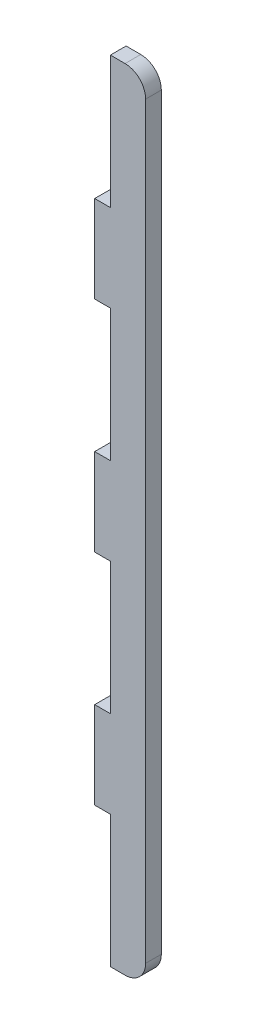
ISO-10303-21;
HEADER;
FILE_DESCRIPTION(('STEP AP214'),'2;1');
FILE_NAME('part.step','',(''),(''),'','','');
FILE_SCHEMA(('AUTOMOTIVE_DESIGN { 1 0 10303 214 1 1 1 1 }'));
ENDSEC;
DATA;
#1=APPLICATION_CONTEXT('core data for automotive mechanical design processes');
#2=APPLICATION_PROTOCOL_DEFINITION('international standard','automotive_design',2000,#1);
#3=PRODUCT_CONTEXT('',#1,'mechanical');
#4=PRODUCT('Part','Part','',(#3));
#5=PRODUCT_RELATED_PRODUCT_CATEGORY('part','',(#4));
#6=PRODUCT_DEFINITION_FORMATION('','',#4);
#7=PRODUCT_DEFINITION_CONTEXT('part definition',#1,'design');
#8=PRODUCT_DEFINITION('design','',#6,#7);
#9=PRODUCT_DEFINITION_SHAPE('','',#8);
#10=(LENGTH_UNIT() NAMED_UNIT(*) SI_UNIT(.MILLI.,.METRE.));
#11=(NAMED_UNIT(*) PLANE_ANGLE_UNIT() SI_UNIT($,.RADIAN.));
#12=(NAMED_UNIT(*) SI_UNIT($,.STERADIAN.) SOLID_ANGLE_UNIT());
#13=UNCERTAINTY_MEASURE_WITH_UNIT(LENGTH_MEASURE(1.E-05),#10,'distance_accuracy_value','');
#14=(GEOMETRIC_REPRESENTATION_CONTEXT(3) GLOBAL_UNCERTAINTY_ASSIGNED_CONTEXT((#13)) GLOBAL_UNIT_ASSIGNED_CONTEXT((#10,
#11,#12)) REPRESENTATION_CONTEXT('',''));
#15=CARTESIAN_POINT('',(0.,0.,0.));
#16=DIRECTION('',(0.,0.,1.));
#17=DIRECTION('',(1.,0.,0.));
#18=AXIS2_PLACEMENT_3D('',#15,#16,#17);
#19=CARTESIAN_POINT('',(0.,0.,5.35));
#20=DIRECTION('',(1.,0.,0.));
#21=DIRECTION('',(0.,1.,0.));
#22=AXIS2_PLACEMENT_3D('',#19,#20,#21);
#23=PLANE('',#22);
#24=DIRECTION('',(0.,-1.,0.));
#25=VECTOR('',#24,1.);
#26=CARTESIAN_POINT('',(0.,0.,0.));
#27=LINE('',#26,#25);
#28=CARTESIAN_POINT('',(0.,45.0005,0.));
#29=VERTEX_POINT('',#28);
#30=CARTESIAN_POINT('',(0.,0.,0.));
#31=VERTEX_POINT('',#30);
#32=EDGE_CURVE('E189',#29,#31,#27,.T.);
#33=ORIENTED_EDGE('',*,*,#32,.T.);
#34=DIRECTION('',(0.,0.,-1.));
#35=VECTOR('',#34,1.);
#36=CARTESIAN_POINT('',(0.,0.,5.35));
#37=LINE('',#36,#35);
#38=CARTESIAN_POINT('',(0.,0.,5.35));
#39=VERTEX_POINT('',#38);
#40=EDGE_CURVE('E11',#39,#31,#37,.T.);
#41=ORIENTED_EDGE('',*,*,#40,.F.);
#42=DIRECTION('',(0.,-1.,0.));
#43=VECTOR('',#42,1.);
#44=CARTESIAN_POINT('',(0.,0.,5.35));
#45=LINE('',#44,#43);
#46=CARTESIAN_POINT('',(0.,45.0005,5.35));
#47=VERTEX_POINT('',#46);
#48=EDGE_CURVE('E223',#47,#39,#45,.T.);
#49=ORIENTED_EDGE('',*,*,#48,.F.);
#50=DIRECTION('',(0.,0.,-1.));
#51=VECTOR('',#50,1.);
#52=CARTESIAN_POINT('',(0.,45.0005,5.35));
#53=LINE('',#52,#51);
#54=EDGE_CURVE('E185',#47,#29,#53,.T.);
#55=ORIENTED_EDGE('',*,*,#54,.T.);
#56=EDGE_LOOP('',(#33,#41,#49,#55));
#57=FACE_BOUND('',#56,.T.);
#58=ADVANCED_FACE('F33',(#57),#23,.F.);
#59=CARTESIAN_POINT('',(0.,0.,5.35));
#60=DIRECTION('',(0.,1.,0.));
#61=DIRECTION('',(0.,0.,1.));
#62=AXIS2_PLACEMENT_3D('',#59,#60,#61);
#63=PLANE('',#62);
#64=DIRECTION('',(1.,0.,0.));
#65=VECTOR('',#64,1.);
#66=CARTESIAN_POINT('',(0.,0.,0.));
#67=LINE('',#66,#65);
#68=CARTESIAN_POINT('',(5.,0.,0.));
#69=VERTEX_POINT('',#68);
#70=EDGE_CURVE('E192',#31,#69,#67,.T.);
#71=ORIENTED_EDGE('',*,*,#70,.T.);
#72=DIRECTION('',(0.,0.,-1.));
#73=VECTOR('',#72,1.);
#74=CARTESIAN_POINT('',(5.,0.,5.35));
#75=LINE('',#74,#73);
#76=CARTESIAN_POINT('',(5.,0.,5.35));
#77=VERTEX_POINT('',#76);
#78=EDGE_CURVE('E41',#77,#69,#75,.T.);
#79=ORIENTED_EDGE('',*,*,#78,.F.);
#80=DIRECTION('',(1.,0.,0.));
#81=VECTOR('',#80,1.);
#82=CARTESIAN_POINT('',(0.,0.,5.35));
#83=LINE('',#82,#81);
#84=EDGE_CURVE('E122',#39,#77,#83,.T.);
#85=ORIENTED_EDGE('',*,*,#84,.F.);
#86=ORIENTED_EDGE('',*,*,#40,.T.);
#87=EDGE_LOOP('',(#71,#79,#85,#86));
#88=FACE_BOUND('',#87,.T.);
#89=ADVANCED_FACE('F331',(#88),#63,.F.);
#90=CARTESIAN_POINT('',(5.,7.00000000000001,5.35));
#91=DIRECTION('',(0.,0.,-1.));
#92=DIRECTION('',(-1.,0.,0.));
#93=AXIS2_PLACEMENT_3D('',#90,#91,#92);
#94=CYLINDRICAL_SURFACE('',#93,7.);
#95=CARTESIAN_POINT('',(5.,7.00000000000001,0.));
#96=DIRECTION('',(0.,0.,1.));
#97=DIRECTION('',(1.,0.,0.));
#98=AXIS2_PLACEMENT_3D('',#95,#96,#97);
#99=CIRCLE('',#98,7.);
#100=CARTESIAN_POINT('',(12.,7.,0.));
#101=VERTEX_POINT('',#100);
#102=EDGE_CURVE('E194',#69,#101,#99,.T.);
#103=ORIENTED_EDGE('',*,*,#102,.T.);
#104=DIRECTION('',(0.,0.,-1.));
#105=VECTOR('',#104,1.);
#106=CARTESIAN_POINT('',(12.,7.,5.35));
#107=LINE('',#106,#105);
#108=CARTESIAN_POINT('',(12.,7.,5.35));
#109=VERTEX_POINT('',#108);
#110=EDGE_CURVE('E260',#109,#101,#107,.T.);
#111=ORIENTED_EDGE('',*,*,#110,.F.);
#112=CARTESIAN_POINT('',(5.,7.00000000000001,5.35));
#113=DIRECTION('',(0.,0.,1.));
#114=DIRECTION('',(1.,0.,0.));
#115=AXIS2_PLACEMENT_3D('',#112,#113,#114);
#116=CIRCLE('',#115,7.);
#117=EDGE_CURVE('E268',#77,#109,#116,.T.);
#118=ORIENTED_EDGE('',*,*,#117,.F.);
#119=ORIENTED_EDGE('',*,*,#78,.T.);
#120=EDGE_LOOP('',(#103,#111,#118,#119));
#121=FACE_BOUND('',#120,.T.);
#122=ADVANCED_FACE('F266',(#121),#94,.T.);
#123=CARTESIAN_POINT('',(12.,7.,5.35));
#124=DIRECTION('',(-1.,0.,0.));
#125=DIRECTION('',(0.,-1.,0.));
#126=AXIS2_PLACEMENT_3D('',#123,#124,#125);
#127=PLANE('',#126);
#128=DIRECTION('',(0.,1.,0.));
#129=VECTOR('',#128,1.);
#130=CARTESIAN_POINT('',(12.,7.,0.));
#131=LINE('',#130,#129);
#132=CARTESIAN_POINT('',(12.,262.,0.));
#133=VERTEX_POINT('',#132);
#134=EDGE_CURVE('E196',#101,#133,#131,.T.);
#135=ORIENTED_EDGE('',*,*,#134,.T.);
#136=DIRECTION('',(0.,0.,-1.));
#137=VECTOR('',#136,1.);
#138=CARTESIAN_POINT('',(12.,262.,5.35));
#139=LINE('',#138,#137);
#140=CARTESIAN_POINT('',(12.,262.,5.35));
#141=VERTEX_POINT('',#140);
#142=EDGE_CURVE('E257',#141,#133,#139,.T.);
#143=ORIENTED_EDGE('',*,*,#142,.F.);
#144=DIRECTION('',(0.,1.,0.));
#145=VECTOR('',#144,1.);
#146=CARTESIAN_POINT('',(12.,7.,5.35));
#147=LINE('',#146,#145);
#148=EDGE_CURVE('E286',#109,#141,#147,.T.);
#149=ORIENTED_EDGE('',*,*,#148,.F.);
#150=ORIENTED_EDGE('',*,*,#110,.T.);
#151=EDGE_LOOP('',(#135,#143,#149,#150));
#152=FACE_BOUND('',#151,.T.);
#153=ADVANCED_FACE('F277',(#152),#127,.F.);
#154=CARTESIAN_POINT('',(5.,262.,5.35));
#155=DIRECTION('',(0.,0.,-1.));
#156=DIRECTION('',(-1.,0.,0.));
#157=AXIS2_PLACEMENT_3D('',#154,#155,#156);
#158=CYLINDRICAL_SURFACE('',#157,7.);
#159=CARTESIAN_POINT('',(5.,262.,0.));
#160=DIRECTION('',(0.,0.,1.));
#161=DIRECTION('',(1.,0.,0.));
#162=AXIS2_PLACEMENT_3D('',#159,#160,#161);
#163=CIRCLE('',#162,7.);
#164=CARTESIAN_POINT('',(5.,269.,0.));
#165=VERTEX_POINT('',#164);
#166=EDGE_CURVE('E198',#133,#165,#163,.T.);
#167=ORIENTED_EDGE('',*,*,#166,.T.);
#168=DIRECTION('',(0.,0.,-1.));
#169=VECTOR('',#168,1.);
#170=CARTESIAN_POINT('',(5.,269.,5.35));
#171=LINE('',#170,#169);
#172=CARTESIAN_POINT('',(5.,269.,5.35));
#173=VERTEX_POINT('',#172);
#174=EDGE_CURVE('E254',#173,#165,#171,.T.);
#175=ORIENTED_EDGE('',*,*,#174,.F.);
#176=CARTESIAN_POINT('',(5.,262.,5.35));
#177=DIRECTION('',(0.,0.,1.));
#178=DIRECTION('',(1.,0.,0.));
#179=AXIS2_PLACEMENT_3D('',#176,#177,#178);
#180=CIRCLE('',#179,7.);
#181=EDGE_CURVE('E283',#141,#173,#180,.T.);
#182=ORIENTED_EDGE('',*,*,#181,.F.);
#183=ORIENTED_EDGE('',*,*,#142,.T.);
#184=EDGE_LOOP('',(#167,#175,#182,#183));
#185=FACE_BOUND('',#184,.T.);
#186=ADVANCED_FACE('F281',(#185),#158,.T.);
#187=CARTESIAN_POINT('',(0.,269.,5.35));
#188=DIRECTION('',(0.,-1.,0.));
#189=DIRECTION('',(0.,0.,-1.));
#190=AXIS2_PLACEMENT_3D('',#187,#188,#189);
#191=PLANE('',#190);
#192=DIRECTION('',(-1.,0.,0.));
#193=VECTOR('',#192,1.);
#194=CARTESIAN_POINT('',(0.,269.,0.));
#195=LINE('',#194,#193);
#196=CARTESIAN_POINT('',(0.,269.,0.));
#197=VERTEX_POINT('',#196);
#198=EDGE_CURVE('E200',#165,#197,#195,.T.);
#199=ORIENTED_EDGE('',*,*,#198,.T.);
#200=DIRECTION('',(0.,0.,-1.));
#201=VECTOR('',#200,1.);
#202=CARTESIAN_POINT('',(0.,269.,5.35));
#203=LINE('',#202,#201);
#204=CARTESIAN_POINT('',(0.,269.,5.35));
#205=VERTEX_POINT('',#204);
#206=EDGE_CURVE('E251',#205,#197,#203,.T.);
#207=ORIENTED_EDGE('',*,*,#206,.F.);
#208=DIRECTION('',(-1.,0.,0.));
#209=VECTOR('',#208,1.);
#210=CARTESIAN_POINT('',(0.,269.,5.35));
#211=LINE('',#210,#209);
#212=EDGE_CURVE('E285',#173,#205,#211,.T.);
#213=ORIENTED_EDGE('',*,*,#212,.F.);
#214=ORIENTED_EDGE('',*,*,#174,.T.);
#215=EDGE_LOOP('',(#199,#207,#213,#214));
#216=FACE_BOUND('',#215,.T.);
#217=ADVANCED_FACE('F344',(#216),#191,.F.);
#218=CARTESIAN_POINT('',(0.,223.9995,5.35));
#219=DIRECTION('',(1.,0.,0.));
#220=DIRECTION('',(0.,0.,-1.));
#221=AXIS2_PLACEMENT_3D('',#218,#219,#220);
#222=PLANE('',#221);
#223=DIRECTION('',(0.,-1.,0.));
#224=VECTOR('',#223,1.);
#225=CARTESIAN_POINT('',(0.,223.9995,0.));
#226=LINE('',#225,#224);
#227=CARTESIAN_POINT('',(0.,223.9995,0.));
#228=VERTEX_POINT('',#227);
#229=EDGE_CURVE('E202',#197,#228,#226,.T.);
#230=ORIENTED_EDGE('',*,*,#229,.T.);
#231=DIRECTION('',(0.,0.,-1.));
#232=VECTOR('',#231,1.);
#233=CARTESIAN_POINT('',(0.,223.9995,5.35));
#234=LINE('',#233,#232);
#235=CARTESIAN_POINT('',(0.,223.9995,5.35));
#236=VERTEX_POINT('',#235);
#237=EDGE_CURVE('E248',#236,#228,#234,.T.);
#238=ORIENTED_EDGE('',*,*,#237,.F.);
#239=DIRECTION('',(0.,-1.,0.));
#240=VECTOR('',#239,1.);
#241=CARTESIAN_POINT('',(0.,223.9995,5.35));
#242=LINE('',#241,#240);
#243=EDGE_CURVE('E288',#205,#236,#242,.T.);
#244=ORIENTED_EDGE('',*,*,#243,.F.);
#245=ORIENTED_EDGE('',*,*,#206,.T.);
#246=EDGE_LOOP('',(#230,#238,#244,#245));
#247=FACE_BOUND('',#246,.T.);
#248=ADVANCED_FACE('F347',(#247),#222,.F.);
#249=CARTESIAN_POINT('',(0.,223.9995,5.35));
#250=DIRECTION('',(0.,-1.,0.));
#251=DIRECTION('',(0.,0.,-1.));
#252=AXIS2_PLACEMENT_3D('',#249,#250,#251);
#253=PLANE('',#252);
#254=DIRECTION('',(-1.,0.,0.));
#255=VECTOR('',#254,1.);
#256=CARTESIAN_POINT('',(0.,223.9995,0.));
#257=LINE('',#256,#255);
#258=CARTESIAN_POINT('',(-5.35,223.9995,0.));
#259=VERTEX_POINT('',#258);
#260=EDGE_CURVE('E204',#228,#259,#257,.T.);
#261=ORIENTED_EDGE('',*,*,#260,.T.);
#262=DIRECTION('',(0.,0.,-1.));
#263=VECTOR('',#262,1.);
#264=CARTESIAN_POINT('',(-5.35,223.9995,5.35));
#265=LINE('',#264,#263);
#266=CARTESIAN_POINT('',(-5.35,223.9995,5.35));
#267=VERTEX_POINT('',#266);
#268=EDGE_CURVE('E245',#267,#259,#265,.T.);
#269=ORIENTED_EDGE('',*,*,#268,.F.);
#270=DIRECTION('',(-1.,0.,0.));
#271=VECTOR('',#270,1.);
#272=CARTESIAN_POINT('',(0.,223.9995,5.35));
#273=LINE('',#272,#271);
#274=EDGE_CURVE('E294',#236,#267,#273,.T.);
#275=ORIENTED_EDGE('',*,*,#274,.F.);
#276=ORIENTED_EDGE('',*,*,#237,.T.);
#277=EDGE_LOOP('',(#261,#269,#275,#276));
#278=FACE_BOUND('',#277,.T.);
#279=ADVANCED_FACE('F351',(#278),#253,.F.);
#280=CARTESIAN_POINT('',(-5.35,223.9995,5.35));
#281=DIRECTION('',(1.,0.,0.));
#282=DIRECTION('',(0.,1.,0.));
#283=AXIS2_PLACEMENT_3D('',#280,#281,#282);
#284=PLANE('',#283);
#285=DIRECTION('',(0.,-1.,0.));
#286=VECTOR('',#285,1.);
#287=CARTESIAN_POINT('',(-5.35,223.9995,0.));
#288=LINE('',#287,#286);
#289=CARTESIAN_POINT('',(-5.35,194.3335,0.));
#290=VERTEX_POINT('',#289);
#291=EDGE_CURVE('E206',#259,#290,#288,.T.);
#292=ORIENTED_EDGE('',*,*,#291,.T.);
#293=DIRECTION('',(0.,0.,-1.));
#294=VECTOR('',#293,1.);
#295=CARTESIAN_POINT('',(-5.35,194.3335,5.35));
#296=LINE('',#295,#294);
#297=CARTESIAN_POINT('',(-5.35,194.3335,5.35));
#298=VERTEX_POINT('',#297);
#299=EDGE_CURVE('E242',#298,#290,#296,.T.);
#300=ORIENTED_EDGE('',*,*,#299,.F.);
#301=DIRECTION('',(0.,-1.,0.));
#302=VECTOR('',#301,1.);
#303=CARTESIAN_POINT('',(-5.35,223.9995,5.35));
#304=LINE('',#303,#302);
#305=EDGE_CURVE('E296',#267,#298,#304,.T.);
#306=ORIENTED_EDGE('',*,*,#305,.F.);
#307=ORIENTED_EDGE('',*,*,#268,.T.);
#308=EDGE_LOOP('',(#292,#300,#306,#307));
#309=FACE_BOUND('',#308,.T.);
#310=ADVANCED_FACE('F355',(#309),#284,.F.);
#311=CARTESIAN_POINT('',(0.,194.3335,5.35));
#312=DIRECTION('',(0.,1.,0.));
#313=DIRECTION('',(0.,0.,1.));
#314=AXIS2_PLACEMENT_3D('',#311,#312,#313);
#315=PLANE('',#314);
#316=DIRECTION('',(1.,0.,0.));
#317=VECTOR('',#316,1.);
#318=CARTESIAN_POINT('',(0.,194.3335,0.));
#319=LINE('',#318,#317);
#320=CARTESIAN_POINT('',(0.,194.3335,0.));
#321=VERTEX_POINT('',#320);
#322=EDGE_CURVE('E208',#290,#321,#319,.T.);
#323=ORIENTED_EDGE('',*,*,#322,.T.);
#324=DIRECTION('',(0.,0.,-1.));
#325=VECTOR('',#324,1.);
#326=CARTESIAN_POINT('',(0.,194.3335,5.35));
#327=LINE('',#326,#325);
#328=CARTESIAN_POINT('',(0.,194.3335,5.35));
#329=VERTEX_POINT('',#328);
#330=EDGE_CURVE('E239',#329,#321,#327,.T.);
#331=ORIENTED_EDGE('',*,*,#330,.F.);
#332=DIRECTION('',(1.,0.,0.));
#333=VECTOR('',#332,1.);
#334=CARTESIAN_POINT('',(0.,194.3335,5.35));
#335=LINE('',#334,#333);
#336=EDGE_CURVE('E298',#298,#329,#335,.T.);
#337=ORIENTED_EDGE('',*,*,#336,.F.);
#338=ORIENTED_EDGE('',*,*,#299,.T.);
#339=EDGE_LOOP('',(#323,#331,#337,#338));
#340=FACE_BOUND('',#339,.T.);
#341=ADVANCED_FACE('F359',(#340),#315,.F.);
#342=CARTESIAN_POINT('',(0.,149.333,5.35));
#343=DIRECTION('',(1.,0.,0.));
#344=DIRECTION('',(0.,1.,0.));
#345=AXIS2_PLACEMENT_3D('',#342,#343,#344);
#346=PLANE('',#345);
#347=DIRECTION('',(0.,-1.,0.));
#348=VECTOR('',#347,1.);
#349=CARTESIAN_POINT('',(0.,149.333,0.));
#350=LINE('',#349,#348);
#351=CARTESIAN_POINT('',(0.,149.333,0.));
#352=VERTEX_POINT('',#351);
#353=EDGE_CURVE('E210',#321,#352,#350,.T.);
#354=ORIENTED_EDGE('',*,*,#353,.T.);
#355=DIRECTION('',(0.,0.,-1.));
#356=VECTOR('',#355,1.);
#357=CARTESIAN_POINT('',(0.,149.333,5.35));
#358=LINE('',#357,#356);
#359=CARTESIAN_POINT('',(0.,149.333,5.35));
#360=VERTEX_POINT('',#359);
#361=EDGE_CURVE('E236',#360,#352,#358,.T.);
#362=ORIENTED_EDGE('',*,*,#361,.F.);
#363=DIRECTION('',(0.,-1.,0.));
#364=VECTOR('',#363,1.);
#365=CARTESIAN_POINT('',(0.,149.333,5.35));
#366=LINE('',#365,#364);
#367=EDGE_CURVE('E300',#329,#360,#366,.T.);
#368=ORIENTED_EDGE('',*,*,#367,.F.);
#369=ORIENTED_EDGE('',*,*,#330,.T.);
#370=EDGE_LOOP('',(#354,#362,#368,#369));
#371=FACE_BOUND('',#370,.T.);
#372=ADVANCED_FACE('F363',(#371),#346,.F.);
#373=CARTESIAN_POINT('',(0.,149.333,5.35));
#374=DIRECTION('',(0.,-1.,0.));
#375=DIRECTION('',(0.,0.,-1.));
#376=AXIS2_PLACEMENT_3D('',#373,#374,#375);
#377=PLANE('',#376);
#378=DIRECTION('',(-1.,0.,0.));
#379=VECTOR('',#378,1.);
#380=CARTESIAN_POINT('',(0.,149.333,0.));
#381=LINE('',#380,#379);
#382=CARTESIAN_POINT('',(-5.35,149.333,0.));
#383=VERTEX_POINT('',#382);
#384=EDGE_CURVE('E212',#352,#383,#381,.T.);
#385=ORIENTED_EDGE('',*,*,#384,.T.);
#386=DIRECTION('',(0.,0.,-1.));
#387=VECTOR('',#386,1.);
#388=CARTESIAN_POINT('',(-5.35,149.333,5.35));
#389=LINE('',#388,#387);
#390=CARTESIAN_POINT('',(-5.35,149.333,5.35));
#391=VERTEX_POINT('',#390);
#392=EDGE_CURVE('E233',#391,#383,#389,.T.);
#393=ORIENTED_EDGE('',*,*,#392,.F.);
#394=DIRECTION('',(-1.,0.,0.));
#395=VECTOR('',#394,1.);
#396=CARTESIAN_POINT('',(0.,149.333,5.35));
#397=LINE('',#396,#395);
#398=EDGE_CURVE('E302',#360,#391,#397,.T.);
#399=ORIENTED_EDGE('',*,*,#398,.F.);
#400=ORIENTED_EDGE('',*,*,#361,.T.);
#401=EDGE_LOOP('',(#385,#393,#399,#400));
#402=FACE_BOUND('',#401,.T.);
#403=ADVANCED_FACE('F367',(#402),#377,.F.);
#404=CARTESIAN_POINT('',(-5.35,149.333,5.35));
#405=DIRECTION('',(1.,0.,0.));
#406=DIRECTION('',(0.,1.,0.));
#407=AXIS2_PLACEMENT_3D('',#404,#405,#406);
#408=PLANE('',#407);
#409=DIRECTION('',(0.,-1.,0.));
#410=VECTOR('',#409,1.);
#411=CARTESIAN_POINT('',(-5.35,149.333,0.));
#412=LINE('',#411,#410);
#413=CARTESIAN_POINT('',(-5.35,119.667,0.));
#414=VERTEX_POINT('',#413);
#415=EDGE_CURVE('E214',#383,#414,#412,.T.);
#416=ORIENTED_EDGE('',*,*,#415,.T.);
#417=DIRECTION('',(0.,0.,-1.));
#418=VECTOR('',#417,1.);
#419=CARTESIAN_POINT('',(-5.35,119.667,5.35));
#420=LINE('',#419,#418);
#421=CARTESIAN_POINT('',(-5.35,119.667,5.35));
#422=VERTEX_POINT('',#421);
#423=EDGE_CURVE('E230',#422,#414,#420,.T.);
#424=ORIENTED_EDGE('',*,*,#423,.F.);
#425=DIRECTION('',(0.,-1.,0.));
#426=VECTOR('',#425,1.);
#427=CARTESIAN_POINT('',(-5.35,149.333,5.35));
#428=LINE('',#427,#426);
#429=EDGE_CURVE('E304',#391,#422,#428,.T.);
#430=ORIENTED_EDGE('',*,*,#429,.F.);
#431=ORIENTED_EDGE('',*,*,#392,.T.);
#432=EDGE_LOOP('',(#416,#424,#430,#431));
#433=FACE_BOUND('',#432,.T.);
#434=ADVANCED_FACE('F371',(#433),#408,.F.);
#435=CARTESIAN_POINT('',(0.,119.667,5.35));
#436=DIRECTION('',(0.,1.,0.));
#437=DIRECTION('',(0.,0.,1.));
#438=AXIS2_PLACEMENT_3D('',#435,#436,#437);
#439=PLANE('',#438);
#440=DIRECTION('',(1.,0.,0.));
#441=VECTOR('',#440,1.);
#442=CARTESIAN_POINT('',(0.,119.667,0.));
#443=LINE('',#442,#441);
#444=CARTESIAN_POINT('',(0.,119.667,0.));
#445=VERTEX_POINT('',#444);
#446=EDGE_CURVE('E216',#414,#445,#443,.T.);
#447=ORIENTED_EDGE('',*,*,#446,.T.);
#448=DIRECTION('',(0.,0.,-1.));
#449=VECTOR('',#448,1.);
#450=CARTESIAN_POINT('',(0.,119.667,5.35));
#451=LINE('',#450,#449);
#452=CARTESIAN_POINT('',(0.,119.667,5.35));
#453=VERTEX_POINT('',#452);
#454=EDGE_CURVE('E227',#453,#445,#451,.T.);
#455=ORIENTED_EDGE('',*,*,#454,.F.);
#456=DIRECTION('',(1.,0.,0.));
#457=VECTOR('',#456,1.);
#458=CARTESIAN_POINT('',(0.,119.667,5.35));
#459=LINE('',#458,#457);
#460=EDGE_CURVE('E306',#422,#453,#459,.T.);
#461=ORIENTED_EDGE('',*,*,#460,.F.);
#462=ORIENTED_EDGE('',*,*,#423,.T.);
#463=EDGE_LOOP('',(#447,#455,#461,#462));
#464=FACE_BOUND('',#463,.T.);
#465=ADVANCED_FACE('F312',(#464),#439,.F.);
#466=CARTESIAN_POINT('',(0.,74.6665,5.35));
#467=DIRECTION('',(1.,0.,0.));
#468=DIRECTION('',(0.,1.,0.));
#469=AXIS2_PLACEMENT_3D('',#466,#467,#468);
#470=PLANE('',#469);
#471=DIRECTION('',(0.,-1.,0.));
#472=VECTOR('',#471,1.);
#473=CARTESIAN_POINT('',(0.,74.6665,0.));
#474=LINE('',#473,#472);
#475=CARTESIAN_POINT('',(0.,74.6665,0.));
#476=VERTEX_POINT('',#475);
#477=EDGE_CURVE('E218',#445,#476,#474,.T.);
#478=ORIENTED_EDGE('',*,*,#477,.T.);
#479=DIRECTION('',(0.,0.,-1.));
#480=VECTOR('',#479,1.);
#481=CARTESIAN_POINT('',(0.,74.6665,5.35));
#482=LINE('',#481,#480);
#483=CARTESIAN_POINT('',(0.,74.6665,5.35));
#484=VERTEX_POINT('',#483);
#485=EDGE_CURVE('E180',#484,#476,#482,.T.);
#486=ORIENTED_EDGE('',*,*,#485,.F.);
#487=DIRECTION('',(0.,-1.,0.));
#488=VECTOR('',#487,1.);
#489=CARTESIAN_POINT('',(0.,74.6665,5.35));
#490=LINE('',#489,#488);
#491=EDGE_CURVE('E171',#453,#484,#490,.T.);
#492=ORIENTED_EDGE('',*,*,#491,.F.);
#493=ORIENTED_EDGE('',*,*,#454,.T.);
#494=EDGE_LOOP('',(#478,#486,#492,#493));
#495=FACE_BOUND('',#494,.T.);
#496=ADVANCED_FACE('F316',(#495),#470,.F.);
#497=CARTESIAN_POINT('',(0.,74.6665,5.35));
#498=DIRECTION('',(0.,-1.,0.));
#499=DIRECTION('',(0.,0.,-1.));
#500=AXIS2_PLACEMENT_3D('',#497,#498,#499);
#501=PLANE('',#500);
#502=DIRECTION('',(-1.,0.,0.));
#503=VECTOR('',#502,1.);
#504=CARTESIAN_POINT('',(0.,74.6665,0.));
#505=LINE('',#504,#503);
#506=CARTESIAN_POINT('',(-5.35,74.6665,0.));
#507=VERTEX_POINT('',#506);
#508=EDGE_CURVE('E179',#476,#507,#505,.T.);
#509=ORIENTED_EDGE('',*,*,#508,.T.);
#510=DIRECTION('',(0.,0.,-1.));
#511=VECTOR('',#510,1.);
#512=CARTESIAN_POINT('',(-5.35,74.6665,5.35));
#513=LINE('',#512,#511);
#514=CARTESIAN_POINT('',(-5.35,74.6665,5.35));
#515=VERTEX_POINT('',#514);
#516=EDGE_CURVE('E176',#515,#507,#513,.T.);
#517=ORIENTED_EDGE('',*,*,#516,.F.);
#518=DIRECTION('',(-1.,0.,0.));
#519=VECTOR('',#518,1.);
#520=CARTESIAN_POINT('',(0.,74.6665,5.35));
#521=LINE('',#520,#519);
#522=EDGE_CURVE('E165',#484,#515,#521,.T.);
#523=ORIENTED_EDGE('',*,*,#522,.F.);
#524=ORIENTED_EDGE('',*,*,#485,.T.);
#525=EDGE_LOOP('',(#509,#517,#523,#524));
#526=FACE_BOUND('',#525,.T.);
#527=ADVANCED_FACE('F177',(#526),#501,.F.);
#528=CARTESIAN_POINT('',(-5.35,74.6665,5.35));
#529=DIRECTION('',(1.,0.,0.));
#530=DIRECTION('',(0.,1.,0.));
#531=AXIS2_PLACEMENT_3D('',#528,#529,#530);
#532=PLANE('',#531);
#533=DIRECTION('',(0.,-1.,0.));
#534=VECTOR('',#533,1.);
#535=CARTESIAN_POINT('',(-5.35,74.6665,0.));
#536=LINE('',#535,#534);
#537=CARTESIAN_POINT('',(-5.35,45.0005,0.));
#538=VERTEX_POINT('',#537);
#539=EDGE_CURVE('E108',#507,#538,#536,.T.);
#540=ORIENTED_EDGE('',*,*,#539,.T.);
#541=DIRECTION('',(0.,0.,-1.));
#542=VECTOR('',#541,1.);
#543=CARTESIAN_POINT('',(-5.35,45.0005,5.35));
#544=LINE('',#543,#542);
#545=CARTESIAN_POINT('',(-5.35,45.0005,5.35));
#546=VERTEX_POINT('',#545);
#547=EDGE_CURVE('E181',#546,#538,#544,.T.);
#548=ORIENTED_EDGE('',*,*,#547,.F.);
#549=DIRECTION('',(0.,-1.,0.));
#550=VECTOR('',#549,1.);
#551=CARTESIAN_POINT('',(-5.35,74.6665,5.35));
#552=LINE('',#551,#550);
#553=EDGE_CURVE('E169',#515,#546,#552,.T.);
#554=ORIENTED_EDGE('',*,*,#553,.F.);
#555=ORIENTED_EDGE('',*,*,#516,.T.);
#556=EDGE_LOOP('',(#540,#548,#554,#555));
#557=FACE_BOUND('',#556,.T.);
#558=ADVANCED_FACE('F183',(#557),#532,.F.);
#559=CARTESIAN_POINT('',(0.,45.0005,5.35));
#560=DIRECTION('',(0.,1.,0.));
#561=DIRECTION('',(0.,0.,1.));
#562=AXIS2_PLACEMENT_3D('',#559,#560,#561);
#563=PLANE('',#562);
#564=DIRECTION('',(1.,0.,0.));
#565=VECTOR('',#564,1.);
#566=CARTESIAN_POINT('',(0.,45.0005,0.));
#567=LINE('',#566,#565);
#568=EDGE_CURVE('E114',#538,#29,#567,.T.);
#569=ORIENTED_EDGE('',*,*,#568,.T.);
#570=ORIENTED_EDGE('',*,*,#54,.F.);
#571=DIRECTION('',(1.,0.,0.));
#572=VECTOR('',#571,1.);
#573=CARTESIAN_POINT('',(0.,45.0005,5.35));
#574=LINE('',#573,#572);
#575=EDGE_CURVE('E49',#546,#47,#574,.T.);
#576=ORIENTED_EDGE('',*,*,#575,.F.);
#577=ORIENTED_EDGE('',*,*,#547,.T.);
#578=EDGE_LOOP('',(#569,#570,#576,#577));
#579=FACE_BOUND('',#578,.T.);
#580=ADVANCED_FACE('F320',(#579),#563,.F.);
#581=CARTESIAN_POINT('',(5.,262.,5.35));
#582=DIRECTION('',(0.,0.,1.));
#583=DIRECTION('',(1.,0.,0.));
#584=AXIS2_PLACEMENT_3D('',#581,#582,#583);
#585=PLANE('',#584);
#586=ORIENTED_EDGE('',*,*,#48,.T.);
#587=ORIENTED_EDGE('',*,*,#84,.T.);
#588=ORIENTED_EDGE('',*,*,#117,.T.);
#589=ORIENTED_EDGE('',*,*,#148,.T.);
#590=ORIENTED_EDGE('',*,*,#181,.T.);
#591=ORIENTED_EDGE('',*,*,#212,.T.);
#592=ORIENTED_EDGE('',*,*,#243,.T.);
#593=ORIENTED_EDGE('',*,*,#274,.T.);
#594=ORIENTED_EDGE('',*,*,#305,.T.);
#595=ORIENTED_EDGE('',*,*,#336,.T.);
#596=ORIENTED_EDGE('',*,*,#367,.T.);
#597=ORIENTED_EDGE('',*,*,#398,.T.);
#598=ORIENTED_EDGE('',*,*,#429,.T.);
#599=ORIENTED_EDGE('',*,*,#460,.T.);
#600=ORIENTED_EDGE('',*,*,#491,.T.);
#601=ORIENTED_EDGE('',*,*,#522,.T.);
#602=ORIENTED_EDGE('',*,*,#553,.T.);
#603=ORIENTED_EDGE('',*,*,#575,.T.);
#604=EDGE_LOOP('',(#586,#587,#588,#589,#590,#591,#592,#593,#594,#595,#596,#597,#598,#599,#600,
#601,#602,#603));
#605=FACE_BOUND('',#604,.T.);
#606=ADVANCED_FACE('F167',(#605),#585,.T.);
#607=CARTESIAN_POINT('',(5.,262.,0.));
#608=DIRECTION('',(0.,0.,1.));
#609=DIRECTION('',(1.,0.,0.));
#610=AXIS2_PLACEMENT_3D('',#607,#608,#609);
#611=PLANE('',#610);
#612=ORIENTED_EDGE('',*,*,#32,.F.);
#613=ORIENTED_EDGE('',*,*,#568,.F.);
#614=ORIENTED_EDGE('',*,*,#539,.F.);
#615=ORIENTED_EDGE('',*,*,#508,.F.);
#616=ORIENTED_EDGE('',*,*,#477,.F.);
#617=ORIENTED_EDGE('',*,*,#446,.F.);
#618=ORIENTED_EDGE('',*,*,#415,.F.);
#619=ORIENTED_EDGE('',*,*,#384,.F.);
#620=ORIENTED_EDGE('',*,*,#353,.F.);
#621=ORIENTED_EDGE('',*,*,#322,.F.);
#622=ORIENTED_EDGE('',*,*,#291,.F.);
#623=ORIENTED_EDGE('',*,*,#260,.F.);
#624=ORIENTED_EDGE('',*,*,#229,.F.);
#625=ORIENTED_EDGE('',*,*,#198,.F.);
#626=ORIENTED_EDGE('',*,*,#166,.F.);
#627=ORIENTED_EDGE('',*,*,#134,.F.);
#628=ORIENTED_EDGE('',*,*,#102,.F.);
#629=ORIENTED_EDGE('',*,*,#70,.F.);
#630=EDGE_LOOP('',(#612,#613,#614,#615,#616,#617,#618,#619,#620,#621,#622,#623,#624,#625,#626,
#627,#628,#629));
#631=FACE_BOUND('',#630,.T.);
#632=ADVANCED_FACE('F272',(#631),#611,.F.);
#633=CLOSED_SHELL('',(#58,#89,#122,#153,#186,#217,#248,#279,#310,#341,#372,#403,#434,#465,#496,
#527,#558,#580,#606,#632));
#634=MANIFOLD_SOLID_BREP('B2',#633);
#635=ADVANCED_BREP_SHAPE_REPRESENTATION('',(#18,#634),#14);
#636=SHAPE_DEFINITION_REPRESENTATION(#9,#635);
ENDSEC;
END-ISO-10303-21;
